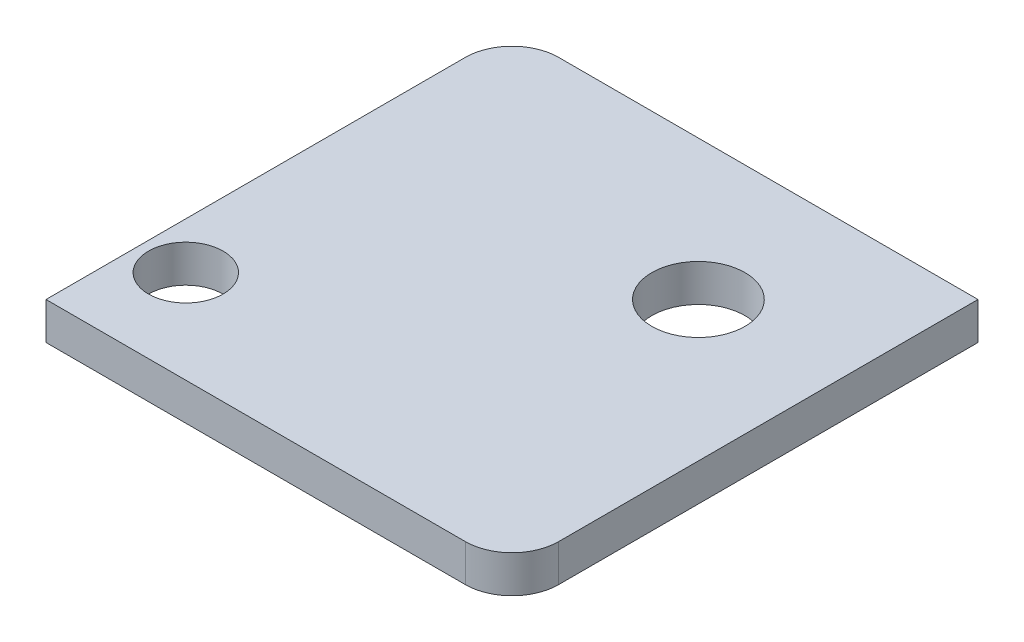
ISO-10303-21;
HEADER;
FILE_DESCRIPTION(('STEP AP214'),'2;1');
FILE_NAME('part.step','',(''),(''),'','','');
FILE_SCHEMA(('AUTOMOTIVE_DESIGN { 1 0 10303 214 1 1 1 1 }'));
ENDSEC;
DATA;
#1=APPLICATION_CONTEXT('core data for automotive mechanical design processes');
#2=APPLICATION_PROTOCOL_DEFINITION('international standard','automotive_design',2000,#1);
#3=PRODUCT_CONTEXT('',#1,'mechanical');
#4=PRODUCT('Part','Part','',(#3));
#5=PRODUCT_RELATED_PRODUCT_CATEGORY('part','',(#4));
#6=PRODUCT_DEFINITION_FORMATION('','',#4);
#7=PRODUCT_DEFINITION_CONTEXT('part definition',#1,'design');
#8=PRODUCT_DEFINITION('design','',#6,#7);
#9=PRODUCT_DEFINITION_SHAPE('','',#8);
#10=(LENGTH_UNIT() NAMED_UNIT(*) SI_UNIT(.MILLI.,.METRE.));
#11=(NAMED_UNIT(*) PLANE_ANGLE_UNIT() SI_UNIT($,.RADIAN.));
#12=(NAMED_UNIT(*) SI_UNIT($,.STERADIAN.) SOLID_ANGLE_UNIT());
#13=UNCERTAINTY_MEASURE_WITH_UNIT(LENGTH_MEASURE(1.E-05),#10,'distance_accuracy_value','');
#14=(GEOMETRIC_REPRESENTATION_CONTEXT(3) GLOBAL_UNCERTAINTY_ASSIGNED_CONTEXT((#13)) GLOBAL_UNIT_ASSIGNED_CONTEXT((#10,
#11,#12)) REPRESENTATION_CONTEXT('',''));
#15=CARTESIAN_POINT('',(0.,0.,0.));
#16=DIRECTION('',(0.,0.,1.));
#17=DIRECTION('',(1.,0.,0.));
#18=AXIS2_PLACEMENT_3D('',#15,#16,#17);
#19=CARTESIAN_POINT('',(5.,4.,-44.9999999999999));
#20=DIRECTION('',(0.,-1.,0.));
#21=DIRECTION('',(0.,0.,-1.));
#22=AXIS2_PLACEMENT_3D('',#19,#20,#21);
#23=PLANE('',#22);
#24=DIRECTION('',(1.,0.,0.));
#25=VECTOR('',#24,1.);
#26=CARTESIAN_POINT('',(44.9999999999999,4.,0.));
#27=LINE('',#26,#25);
#28=CARTESIAN_POINT('',(0.,4.,0.));
#29=VERTEX_POINT('',#28);
#30=CARTESIAN_POINT('',(44.9999999999999,4.,0.));
#31=VERTEX_POINT('',#30);
#32=EDGE_CURVE('E133',#29,#31,#27,.T.);
#33=ORIENTED_EDGE('',*,*,#32,.T.);
#34=CARTESIAN_POINT('',(44.9999999999999,4.,-5.));
#35=DIRECTION('',(0.,1.,0.));
#36=DIRECTION('',(0.,0.,1.));
#37=AXIS2_PLACEMENT_3D('',#34,#35,#36);
#38=CIRCLE('',#37,5.);
#39=CARTESIAN_POINT('',(49.9999999999999,4.,-5.00000000000003));
#40=VERTEX_POINT('',#39);
#41=EDGE_CURVE('E91',#31,#40,#38,.T.);
#42=ORIENTED_EDGE('',*,*,#41,.T.);
#43=DIRECTION('',(0.,0.,-1.));
#44=VECTOR('',#43,1.);
#45=CARTESIAN_POINT('',(50.,4.,-50.));
#46=LINE('',#45,#44);
#47=CARTESIAN_POINT('',(50.,4.,-50.));
#48=VERTEX_POINT('',#47);
#49=EDGE_CURVE('E104',#40,#48,#46,.T.);
#50=ORIENTED_EDGE('',*,*,#49,.T.);
#51=DIRECTION('',(-1.,0.,0.));
#52=VECTOR('',#51,1.);
#53=CARTESIAN_POINT('',(5.00000000000003,4.,-49.9999999999999));
#54=LINE('',#53,#52);
#55=CARTESIAN_POINT('',(5.,4.,-49.9999999999999));
#56=VERTEX_POINT('',#55);
#57=EDGE_CURVE('E98',#48,#56,#54,.T.);
#58=ORIENTED_EDGE('',*,*,#57,.T.);
#59=CARTESIAN_POINT('',(5.,4.,-44.9999999999999));
#60=DIRECTION('',(0.,1.,0.));
#61=DIRECTION('',(0.,0.,-1.));
#62=AXIS2_PLACEMENT_3D('',#59,#60,#61);
#63=CIRCLE('',#62,5.);
#64=CARTESIAN_POINT('',(0.,4.,-44.9999999999999));
#65=VERTEX_POINT('',#64);
#66=EDGE_CURVE('E102',#56,#65,#63,.T.);
#67=ORIENTED_EDGE('',*,*,#66,.T.);
#68=DIRECTION('',(0.,0.,1.));
#69=VECTOR('',#68,1.);
#70=CARTESIAN_POINT('',(0.,4.,0.));
#71=LINE('',#70,#69);
#72=EDGE_CURVE('E54',#65,#29,#71,.T.);
#73=ORIENTED_EDGE('',*,*,#72,.T.);
#74=EDGE_LOOP('',(#33,#42,#50,#58,#67,#73));
#75=FACE_BOUND('',#74,.T.);
#76=CARTESIAN_POINT('',(5.,4.,-9.99999999999999));
#77=DIRECTION('',(0.,1.,0.));
#78=DIRECTION('',(0.,0.,1.));
#79=AXIS2_PLACEMENT_3D('',#76,#77,#78);
#80=CIRCLE('',#79,4.);
#81=CARTESIAN_POINT('',(5.,4.,-5.99999999999999));
#82=VERTEX_POINT('',#81);
#83=EDGE_CURVE('E126',#82,#82,#80,.T.);
#84=ORIENTED_EDGE('',*,*,#83,.F.);
#85=EDGE_LOOP('',(#84));
#86=FACE_BOUND('',#85,.T.);
#87=CARTESIAN_POINT('',(35.,4.,-35.));
#88=DIRECTION('',(0.,1.,0.));
#89=DIRECTION('',(0.,0.,1.));
#90=AXIS2_PLACEMENT_3D('',#87,#88,#89);
#91=CIRCLE('',#90,5.);
#92=CARTESIAN_POINT('',(35.,4.,-30.));
#93=VERTEX_POINT('',#92);
#94=EDGE_CURVE('E174',#93,#93,#91,.T.);
#95=ORIENTED_EDGE('',*,*,#94,.F.);
#96=EDGE_LOOP('',(#95));
#97=FACE_BOUND('',#96,.T.);
#98=ADVANCED_FACE('F37',(#75,#86,#97),#23,.F.);
#99=CARTESIAN_POINT('',(5.,0.,-44.9999999999999));
#100=DIRECTION('',(0.,-1.,0.));
#101=DIRECTION('',(0.,0.,-1.));
#102=AXIS2_PLACEMENT_3D('',#99,#100,#101);
#103=PLANE('',#102);
#104=CARTESIAN_POINT('',(5.,0.,-9.99999999999999));
#105=DIRECTION('',(0.,1.,0.));
#106=DIRECTION('',(0.,0.,1.));
#107=AXIS2_PLACEMENT_3D('',#104,#105,#106);
#108=CIRCLE('',#107,4.);
#109=CARTESIAN_POINT('',(5.,0.,-5.99999999999999));
#110=VERTEX_POINT('',#109);
#111=EDGE_CURVE('E179',#110,#110,#108,.T.);
#112=ORIENTED_EDGE('',*,*,#111,.T.);
#113=EDGE_LOOP('',(#112));
#114=FACE_BOUND('',#113,.T.);
#115=DIRECTION('',(1.,0.,0.));
#116=VECTOR('',#115,1.);
#117=CARTESIAN_POINT('',(44.9999999999999,0.,0.));
#118=LINE('',#117,#116);
#119=CARTESIAN_POINT('',(0.,0.,0.));
#120=VERTEX_POINT('',#119);
#121=CARTESIAN_POINT('',(44.9999999999999,0.,0.));
#122=VERTEX_POINT('',#121);
#123=EDGE_CURVE('E122',#120,#122,#118,.T.);
#124=ORIENTED_EDGE('',*,*,#123,.F.);
#125=DIRECTION('',(0.,0.,1.));
#126=VECTOR('',#125,1.);
#127=CARTESIAN_POINT('',(0.,0.,0.));
#128=LINE('',#127,#126);
#129=CARTESIAN_POINT('',(0.,0.,-44.9999999999999));
#130=VERTEX_POINT('',#129);
#131=EDGE_CURVE('E83',#130,#120,#128,.T.);
#132=ORIENTED_EDGE('',*,*,#131,.F.);
#133=CARTESIAN_POINT('',(5.,0.,-44.9999999999999));
#134=DIRECTION('',(0.,1.,0.));
#135=DIRECTION('',(0.,0.,-1.));
#136=AXIS2_PLACEMENT_3D('',#133,#134,#135);
#137=CIRCLE('',#136,5.);
#138=CARTESIAN_POINT('',(5.,0.,-49.9999999999999));
#139=VERTEX_POINT('',#138);
#140=EDGE_CURVE('E77',#139,#130,#137,.T.);
#141=ORIENTED_EDGE('',*,*,#140,.F.);
#142=DIRECTION('',(-1.,0.,0.));
#143=VECTOR('',#142,1.);
#144=CARTESIAN_POINT('',(5.00000000000003,0.,-49.9999999999999));
#145=LINE('',#144,#143);
#146=CARTESIAN_POINT('',(50.,0.,-50.));
#147=VERTEX_POINT('',#146);
#148=EDGE_CURVE('E112',#147,#139,#145,.T.);
#149=ORIENTED_EDGE('',*,*,#148,.F.);
#150=DIRECTION('',(0.,0.,-1.));
#151=VECTOR('',#150,1.);
#152=CARTESIAN_POINT('',(50.,0.,-50.));
#153=LINE('',#152,#151);
#154=CARTESIAN_POINT('',(49.9999999999999,0.,-5.00000000000003));
#155=VERTEX_POINT('',#154);
#156=EDGE_CURVE('E128',#155,#147,#153,.T.);
#157=ORIENTED_EDGE('',*,*,#156,.F.);
#158=CARTESIAN_POINT('',(44.9999999999999,0.,-5.));
#159=DIRECTION('',(0.,1.,0.));
#160=DIRECTION('',(0.,0.,1.));
#161=AXIS2_PLACEMENT_3D('',#158,#159,#160);
#162=CIRCLE('',#161,5.);
#163=EDGE_CURVE('E125',#122,#155,#162,.T.);
#164=ORIENTED_EDGE('',*,*,#163,.F.);
#165=EDGE_LOOP('',(#124,#132,#141,#149,#157,#164));
#166=FACE_BOUND('',#165,.T.);
#167=CARTESIAN_POINT('',(35.,0.,-35.));
#168=DIRECTION('',(0.,1.,0.));
#169=DIRECTION('',(0.,0.,1.));
#170=AXIS2_PLACEMENT_3D('',#167,#168,#169);
#171=CIRCLE('',#170,5.);
#172=CARTESIAN_POINT('',(35.,0.,-30.));
#173=VERTEX_POINT('',#172);
#174=EDGE_CURVE('E177',#173,#173,#171,.T.);
#175=ORIENTED_EDGE('',*,*,#174,.T.);
#176=EDGE_LOOP('',(#175));
#177=FACE_BOUND('',#176,.T.);
#178=ADVANCED_FACE('F142',(#114,#166,#177),#103,.T.);
#179=CARTESIAN_POINT('',(44.9999999999999,4.,0.));
#180=DIRECTION('',(0.,0.,-1.));
#181=DIRECTION('',(-1.,0.,0.));
#182=AXIS2_PLACEMENT_3D('',#179,#180,#181);
#183=PLANE('',#182);
#184=ORIENTED_EDGE('',*,*,#123,.T.);
#185=DIRECTION('',(0.,-1.,0.));
#186=VECTOR('',#185,1.);
#187=CARTESIAN_POINT('',(44.9999999999999,4.,0.));
#188=LINE('',#187,#186);
#189=EDGE_CURVE('E11',#31,#122,#188,.T.);
#190=ORIENTED_EDGE('',*,*,#189,.F.);
#191=ORIENTED_EDGE('',*,*,#32,.F.);
#192=DIRECTION('',(0.,-1.,0.));
#193=VECTOR('',#192,1.);
#194=CARTESIAN_POINT('',(0.,4.,0.));
#195=LINE('',#194,#193);
#196=EDGE_CURVE('E118',#29,#120,#195,.T.);
#197=ORIENTED_EDGE('',*,*,#196,.T.);
#198=EDGE_LOOP('',(#184,#190,#191,#197));
#199=FACE_BOUND('',#198,.T.);
#200=ADVANCED_FACE('F39',(#199),#183,.F.);
#201=CARTESIAN_POINT('',(44.9999999999999,4.,-5.));
#202=DIRECTION('',(0.,-1.,0.));
#203=DIRECTION('',(0.,0.,-1.));
#204=AXIS2_PLACEMENT_3D('',#201,#202,#203);
#205=CYLINDRICAL_SURFACE('',#204,5.);
#206=ORIENTED_EDGE('',*,*,#163,.T.);
#207=DIRECTION('',(0.,-1.,0.));
#208=VECTOR('',#207,1.);
#209=CARTESIAN_POINT('',(49.9999999999999,4.,-5.00000000000003));
#210=LINE('',#209,#208);
#211=EDGE_CURVE('E46',#40,#155,#210,.T.);
#212=ORIENTED_EDGE('',*,*,#211,.F.);
#213=ORIENTED_EDGE('',*,*,#41,.F.);
#214=ORIENTED_EDGE('',*,*,#189,.T.);
#215=EDGE_LOOP('',(#206,#212,#213,#214));
#216=FACE_BOUND('',#215,.T.);
#217=ADVANCED_FACE('F226',(#216),#205,.T.);
#218=CARTESIAN_POINT('',(50.,4.,-50.));
#219=DIRECTION('',(-1.,0.,0.));
#220=DIRECTION('',(0.,0.,1.));
#221=AXIS2_PLACEMENT_3D('',#218,#219,#220);
#222=PLANE('',#221);
#223=ORIENTED_EDGE('',*,*,#156,.T.);
#224=DIRECTION('',(0.,-1.,0.));
#225=VECTOR('',#224,1.);
#226=CARTESIAN_POINT('',(50.,4.,-50.));
#227=LINE('',#226,#225);
#228=EDGE_CURVE('E113',#48,#147,#227,.T.);
#229=ORIENTED_EDGE('',*,*,#228,.F.);
#230=ORIENTED_EDGE('',*,*,#49,.F.);
#231=ORIENTED_EDGE('',*,*,#211,.T.);
#232=EDGE_LOOP('',(#223,#229,#230,#231));
#233=FACE_BOUND('',#232,.T.);
#234=ADVANCED_FACE('F139',(#233),#222,.F.);
#235=CARTESIAN_POINT('',(5.00000000000003,4.,-49.9999999999999));
#236=DIRECTION('',(0.,0.,1.));
#237=DIRECTION('',(1.,0.,0.));
#238=AXIS2_PLACEMENT_3D('',#235,#236,#237);
#239=PLANE('',#238);
#240=ORIENTED_EDGE('',*,*,#148,.T.);
#241=DIRECTION('',(0.,-1.,0.));
#242=VECTOR('',#241,1.);
#243=CARTESIAN_POINT('',(5.,4.,-49.9999999999999));
#244=LINE('',#243,#242);
#245=EDGE_CURVE('E109',#56,#139,#244,.T.);
#246=ORIENTED_EDGE('',*,*,#245,.F.);
#247=ORIENTED_EDGE('',*,*,#57,.F.);
#248=ORIENTED_EDGE('',*,*,#228,.T.);
#249=EDGE_LOOP('',(#240,#246,#247,#248));
#250=FACE_BOUND('',#249,.T.);
#251=ADVANCED_FACE('F110',(#250),#239,.F.);
#252=CARTESIAN_POINT('',(5.,4.,-44.9999999999999));
#253=DIRECTION('',(0.,-1.,0.));
#254=DIRECTION('',(0.,0.,-1.));
#255=AXIS2_PLACEMENT_3D('',#252,#253,#254);
#256=CYLINDRICAL_SURFACE('',#255,5.);
#257=ORIENTED_EDGE('',*,*,#140,.T.);
#258=DIRECTION('',(0.,-1.,0.));
#259=VECTOR('',#258,1.);
#260=CARTESIAN_POINT('',(0.,4.,-44.9999999999999));
#261=LINE('',#260,#259);
#262=EDGE_CURVE('E114',#65,#130,#261,.T.);
#263=ORIENTED_EDGE('',*,*,#262,.F.);
#264=ORIENTED_EDGE('',*,*,#66,.F.);
#265=ORIENTED_EDGE('',*,*,#245,.T.);
#266=EDGE_LOOP('',(#257,#263,#264,#265));
#267=FACE_BOUND('',#266,.T.);
#268=ADVANCED_FACE('F116',(#267),#256,.T.);
#269=CARTESIAN_POINT('',(0.,4.,0.));
#270=DIRECTION('',(1.,0.,0.));
#271=DIRECTION('',(0.,0.,-1.));
#272=AXIS2_PLACEMENT_3D('',#269,#270,#271);
#273=PLANE('',#272);
#274=ORIENTED_EDGE('',*,*,#131,.T.);
#275=ORIENTED_EDGE('',*,*,#196,.F.);
#276=ORIENTED_EDGE('',*,*,#72,.F.);
#277=ORIENTED_EDGE('',*,*,#262,.T.);
#278=EDGE_LOOP('',(#274,#275,#276,#277));
#279=FACE_BOUND('',#278,.T.);
#280=ADVANCED_FACE('F147',(#279),#273,.F.);
#281=CARTESIAN_POINT('',(5.,4.,-9.99999999999999));
#282=DIRECTION('',(0.,-1.,0.));
#283=DIRECTION('',(0.,0.,-1.));
#284=AXIS2_PLACEMENT_3D('',#281,#282,#283);
#285=CYLINDRICAL_SURFACE('',#284,4.);
#286=ORIENTED_EDGE('',*,*,#83,.T.);
#287=EDGE_LOOP('',(#286));
#288=FACE_BOUND('',#287,.T.);
#289=ORIENTED_EDGE('',*,*,#111,.F.);
#290=EDGE_LOOP('',(#289));
#291=FACE_BOUND('',#290,.T.);
#292=ADVANCED_FACE('F149',(#288,#291),#285,.F.);
#293=CARTESIAN_POINT('',(35.,4.,-35.));
#294=DIRECTION('',(0.,-1.,0.));
#295=DIRECTION('',(0.,0.,-1.));
#296=AXIS2_PLACEMENT_3D('',#293,#294,#295);
#297=CYLINDRICAL_SURFACE('',#296,5.);
#298=ORIENTED_EDGE('',*,*,#94,.T.);
#299=EDGE_LOOP('',(#298));
#300=FACE_BOUND('',#299,.T.);
#301=ORIENTED_EDGE('',*,*,#174,.F.);
#302=EDGE_LOOP('',(#301));
#303=FACE_BOUND('',#302,.T.);
#304=ADVANCED_FACE('F155',(#300,#303),#297,.F.);
#305=CLOSED_SHELL('',(#98,#178,#200,#217,#234,#251,#268,#280,#292,#304));
#306=MANIFOLD_SOLID_BREP('B2',#305);
#307=ADVANCED_BREP_SHAPE_REPRESENTATION('',(#18,#306),#14);
#308=SHAPE_DEFINITION_REPRESENTATION(#9,#307);
ENDSEC;
END-ISO-10303-21;
